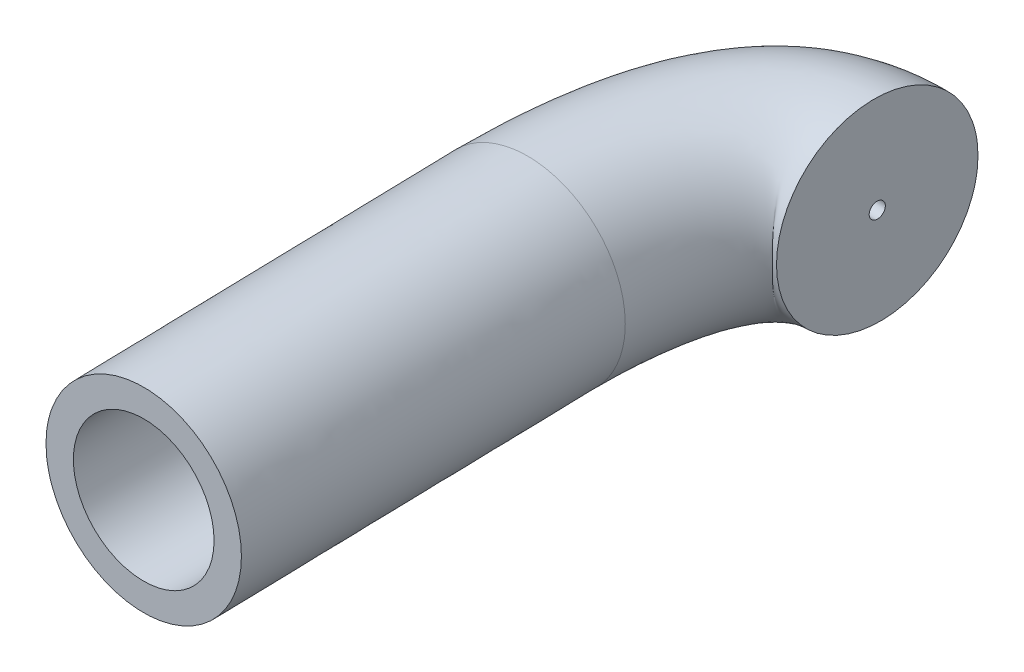
ISO-10303-21;
HEADER;
FILE_DESCRIPTION(('STEP AP214'),'2;1');
FILE_NAME('part.step','',(''),(''),'','','');
FILE_SCHEMA(('AUTOMOTIVE_DESIGN { 1 0 10303 214 1 1 1 1 }'));
ENDSEC;
DATA;
#1=APPLICATION_CONTEXT('core data for automotive mechanical design processes');
#2=APPLICATION_PROTOCOL_DEFINITION('international standard','automotive_design',2000,#1);
#3=PRODUCT_CONTEXT('',#1,'mechanical');
#4=PRODUCT('Part','Part','',(#3));
#5=PRODUCT_RELATED_PRODUCT_CATEGORY('part','',(#4));
#6=PRODUCT_DEFINITION_FORMATION('','',#4);
#7=PRODUCT_DEFINITION_CONTEXT('part definition',#1,'design');
#8=PRODUCT_DEFINITION('design','',#6,#7);
#9=PRODUCT_DEFINITION_SHAPE('','',#8);
#10=(LENGTH_UNIT() NAMED_UNIT(*) SI_UNIT(.MILLI.,.METRE.));
#11=(NAMED_UNIT(*) PLANE_ANGLE_UNIT() SI_UNIT($,.RADIAN.));
#12=(NAMED_UNIT(*) SI_UNIT($,.STERADIAN.) SOLID_ANGLE_UNIT());
#13=UNCERTAINTY_MEASURE_WITH_UNIT(LENGTH_MEASURE(1.E-05),#10,'distance_accuracy_value','');
#14=(GEOMETRIC_REPRESENTATION_CONTEXT(3) GLOBAL_UNCERTAINTY_ASSIGNED_CONTEXT((#13)) GLOBAL_UNIT_ASSIGNED_CONTEXT((#10,
#11,#12)) REPRESENTATION_CONTEXT('',''));
#15=CARTESIAN_POINT('',(0.,0.,0.));
#16=DIRECTION('',(0.,0.,1.));
#17=DIRECTION('',(1.,0.,0.));
#18=AXIS2_PLACEMENT_3D('',#15,#16,#17);
#19=CARTESIAN_POINT('',(0.303189817259408,0.,12.7400996236702));
#20=DIRECTION('',(0.,0.,1.));
#21=DIRECTION('',(1.,0.,0.));
#22=AXIS2_PLACEMENT_3D('',#19,#20,#21);
#23=PLANE('',#22);
#24=CARTESIAN_POINT('',(0.303189817259408,0.,12.7400996236702));
#25=DIRECTION('',(0.,0.,1.));
#26=DIRECTION('',(1.,0.,0.));
#27=AXIS2_PLACEMENT_3D('',#24,#25,#26);
#28=CIRCLE('',#27,2.286);
#29=CARTESIAN_POINT('',(2.58918981725941,0.,12.7400996236702));
#30=VERTEX_POINT('',#29);
#31=EDGE_CURVE('E141',#30,#30,#28,.T.);
#32=ORIENTED_EDGE('',*,*,#31,.F.);
#33=EDGE_LOOP('',(#32));
#34=FACE_BOUND('',#33,.T.);
#35=CARTESIAN_POINT('',(0.303189817259408,0.,12.7400996236702));
#36=DIRECTION('',(0.,0.,1.));
#37=DIRECTION('',(1.,0.,0.));
#38=AXIS2_PLACEMENT_3D('',#35,#36,#37);
#39=CIRCLE('',#38,3.175);
#40=CARTESIAN_POINT('',(3.47818981725941,0.,12.7400996236702));
#41=VERTEX_POINT('',#40);
#42=EDGE_CURVE('E44',#41,#41,#39,.T.);
#43=ORIENTED_EDGE('',*,*,#42,.T.);
#44=EDGE_LOOP('',(#43));
#45=FACE_BOUND('',#44,.T.);
#46=ADVANCED_FACE('F41',(#34,#45),#23,.T.);
#47=CARTESIAN_POINT('',(4.06410833906515,0.,-7.33427679154167));
#48=DIRECTION('',(-0.999500775208623,0.,-0.0315943089394647));
#49=DIRECTION('',(-0.0315943089394647,0.,0.999500775208623));
#50=AXIS2_PLACEMENT_3D('',#47,#48,#49);
#51=PLANE('',#50);
#52=CARTESIAN_POINT('',(4.06410833906515,0.,-7.33427679154167));
#53=DIRECTION('',(0.999500775208623,0.,0.0315943089394649));
#54=DIRECTION('',(0.0315943089394649,0.,-0.999500775208623));
#55=AXIS2_PLACEMENT_3D('',#52,#53,#54);
#56=CIRCLE('',#55,0.254000000000001);
#57=CARTESIAN_POINT('',(4.07213329353578,0.,-7.58814998844466));
#58=VERTEX_POINT('',#57);
#59=EDGE_CURVE('E140',#58,#58,#56,.T.);
#60=ORIENTED_EDGE('',*,*,#59,.F.);
#61=EDGE_LOOP('',(#60));
#62=FACE_BOUND('',#61,.T.);
#63=CARTESIAN_POINT('',(4.06410833906515,0.,-7.33427679154167));
#64=DIRECTION('',(-0.999500775208623,0.,-0.0315943089394647));
#65=DIRECTION('',(-0.0315943089394647,0.,0.999500775208623));
#66=AXIS2_PLACEMENT_3D('',#63,#64,#65);
#67=CIRCLE('',#66,3.175);
#68=CARTESIAN_POINT('',(3.96379640818235,0.,-4.1608618302543));
#69=VERTEX_POINT('',#68);
#70=EDGE_CURVE('E59',#69,#69,#67,.T.);
#71=ORIENTED_EDGE('',*,*,#70,.F.);
#72=EDGE_LOOP('',(#71));
#73=FACE_BOUND('',#72,.T.);
#74=ADVANCED_FACE('F100',(#62,#73),#51,.F.);
#75=CARTESIAN_POINT('',(3.1702417326842,0.,-0.199943389218424));
#76=CARTESIAN_POINT('',(3.47818981725941,0.,12.7400996236702));
#77=CARTESIAN_POINT('',(3.1702417326842,6.35,-0.199943389218423));
#78=CARTESIAN_POINT('',(3.47818981725941,6.35,12.7400996236702));
#79=CARTESIAN_POINT('',(-3.1797582673158,6.35,-0.199943389218423));
#80=CARTESIAN_POINT('',(-2.87181018274059,6.35,12.7400996236702));
#81=CARTESIAN_POINT('',(-3.1797582673158,0.,-0.199943389218424));
#82=CARTESIAN_POINT('',(-2.87181018274059,0.,12.7400996236702));
#83=CARTESIAN_POINT('',(-3.1797582673158,-6.35,-0.199943389218423));
#84=CARTESIAN_POINT('',(-2.87181018274059,-6.35,12.7400996236702));
#85=CARTESIAN_POINT('',(3.1702417326842,-6.35,-0.199943389218423));
#86=CARTESIAN_POINT('',(3.47818981725941,-6.35,12.7400996236702));
#87=CARTESIAN_POINT('',(3.1702417326842,0.,-0.199943389218424));
#88=CARTESIAN_POINT('',(3.47818981725941,0.,12.7400996236702));
#89=(BOUNDED_SURFACE() B_SPLINE_SURFACE(3,1,((#75,#76),(#77,#78),(#79,#80),(#81,#82),(#83,#84),
(#85,#86),(#87,#88)),.UNSPECIFIED.,.T.,.F.,.F.) B_SPLINE_SURFACE_WITH_KNOTS((4,3,4),(2,2),(0.,
0.5,1.),(0.,1.),.UNSPECIFIED.) GEOMETRIC_REPRESENTATION_ITEM() RATIONAL_B_SPLINE_SURFACE(((1.,
1.),(0.333333333333333,0.333333333333333),(0.333333333333333,0.333333333333333),(1.,1.),
(0.333333333333333,0.333333333333333),(0.333333333333333,0.333333333333333),(1.,1.))) REPRESENTATION_ITEM('') SURFACE());
#90=CARTESIAN_POINT('',(0.,-3.175,0.));
#91=CARTESIAN_POINT('',(-0.0243242640618428,-3.17500045158332,0.000288665802833439));
#92=CARTESIAN_POINT('',(-0.0486513394828881,-3.17472058427074,0.000576193073695944));
#93=CARTESIAN_POINT('',(-0.162023609029619,-3.17211134046092,0.00191110235761794));
#94=CARTESIAN_POINT('',(-0.251014858179023,-3.16630984530308,0.00294437193743619));
#95=CARTESIAN_POINT('',(-0.42821263177228,-3.14723858437916,0.00498088866823702));
#96=CARTESIAN_POINT('',(-0.516418835697877,-3.13396589865641,0.00598412391938544));
#97=CARTESIAN_POINT('',(-0.691583746237336,-3.10000777689099,0.00796242018394021));
#98=CARTESIAN_POINT('',(-0.778539646101033,-3.07930775758701,0.00893742166246294));
#99=CARTESIAN_POINT('',(-0.950443872354004,-3.03064206894526,0.0108566255516469));
#100=CARTESIAN_POINT('',(-1.03539056613166,-3.00267069843141,0.0118008031377477));
#101=CARTESIAN_POINT('',(-1.28591482337106,-2.90825029762519,0.0145802700457965));
#102=CARTESIAN_POINT('',(-1.44763363303087,-2.83120584836155,0.0163676000484374));
#103=CARTESIAN_POINT('',(-1.75582617248295,-2.65102291922328,0.0197850179610583));
#104=CARTESIAN_POINT('',(-1.90229920238679,-2.54788324213937,0.0214150986519388));
#105=CARTESIAN_POINT('',(-2.10740340278012,-2.37594171886407,0.0237129504117319));
#106=CARTESIAN_POINT('',(-2.17337881179928,-2.31570706507241,0.0244548295513777));
#107=CARTESIAN_POINT('',(-2.29997655802675,-2.18994189127997,0.0258837254371156));
#108=CARTESIAN_POINT('',(-2.36060400069902,-2.12441653911207,0.0265707944467037));
#109=CARTESIAN_POINT('',(-2.47615330170538,-1.9884584541352,0.0278853744141694));
#110=CARTESIAN_POINT('',(-2.531072369751,-1.9180233492495,0.0285128562326382));
#111=CARTESIAN_POINT('',(-2.63478931443911,-1.77278380873354,0.0297023451376413));
#112=CARTESIAN_POINT('',(-2.68358576783311,-1.69797836308538,0.03026433699838));
#113=CARTESIAN_POINT('',(-2.82022917544752,-1.46779630511198,0.0318435295070483));
#114=CARTESIAN_POINT('',(-2.89843153496795,-1.3065344911588,0.0327551049566311));
#115=CARTESIAN_POINT('',(-3.02661178122052,-0.973259674985233,0.0342558826844416));
#116=CARTESIAN_POINT('',(-3.07659014341516,-0.801246853930925,0.034845090393283));
#117=CARTESIAN_POINT('',(-3.14698932811133,-0.451217089755409,0.0356765567581061));
#118=CARTESIAN_POINT('',(-3.1674044457048,-0.273198994558876,0.03591874844927));
#119=CARTESIAN_POINT('',(-3.17805591152383,0.0837379970835969,0.0360450008852013));
#120=CARTESIAN_POINT('',(-3.16829223222888,0.262656894350844,0.0359290613033832));
#121=CARTESIAN_POINT('',(-3.1188839509595,0.616310971604522,0.0353444207920631));
#122=CARTESIAN_POINT('',(-3.07923694517303,0.791045813859241,0.0348756914841922));
#123=CARTESIAN_POINT('',(-2.97111388367048,1.1314607612037,0.0336051502983484));
#124=CARTESIAN_POINT('',(-2.90263737238336,1.29714072315922,0.0328033331568409));
#125=CARTESIAN_POINT('',(-2.77990418617113,1.5351273560875,0.0313777674541935));
#126=CARTESIAN_POINT('',(-2.73562968539805,1.61273669315896,0.0308651280850067));
#127=CARTESIAN_POINT('',(-2.64070241092992,1.76395324086016,0.0297704578707114));
#128=CARTESIAN_POINT('',(-2.5900511164728,1.83756137400575,0.0291884431204129));
#129=CARTESIAN_POINT('',(-2.48275001495234,1.98021132802885,0.0279607356440589));
#130=CARTESIAN_POINT('',(-2.42610306445553,2.04925529820696,0.0273150732522203));
#131=CARTESIAN_POINT('',(-2.30715713269389,2.18238068792445,0.0259650253020113));
#132=CARTESIAN_POINT('',(-2.24485275098992,2.24645725524428,0.0252605836876141));
#133=CARTESIAN_POINT('',(-2.05028002176849,2.43032926970599,0.0230695700970656));
#134=CARTESIAN_POINT('',(-1.91017037723957,2.54200810462485,0.021503225089679));
#135=CARTESIAN_POINT('',(-1.61317513190899,2.7402146497617,0.0182009858618158));
#136=CARTESIAN_POINT('',(-1.45629014673595,2.82674328251952,0.0164650978635025));
#137=CARTESIAN_POINT('',(-1.21177817413075,2.93588962238645,0.0137572163783273));
#138=CARTESIAN_POINT('',(-1.12863410412454,2.96885878169343,0.0128360348966054));
#139=CARTESIAN_POINT('',(-0.959909870388115,3.02765004611898,0.0109616365599269));
#140=CARTESIAN_POINT('',(-0.874331764016679,3.05347800028465,0.0100084466436609));
#141=CARTESIAN_POINT('',(-0.701465604202956,3.09778254841303,0.00807298944110577));
#142=CARTESIAN_POINT('',(-0.614180911847224,3.11627231239113,0.00709077767759988));
#143=CARTESIAN_POINT('',(-0.43838167441245,3.14583606808765,0.00509637268219461));
#144=CARTESIAN_POINT('',(-0.349867460590093,3.15691201913796,0.00408418744562388));
#145=CARTESIAN_POINT('',(-0.198472285382937,3.16940981183432,0.00233301987873588));
#146=CARTESIAN_POINT('',(-0.13574165777698,3.17271680708173,0.00160164012473092));
#147=CARTESIAN_POINT('',(-0.0486527687669616,3.1747203220212,0.000576211321581473));
#148=CARTESIAN_POINT('',(-0.0243259216950558,3.17500012825551,0.000288687265111917));
#149=CARTESIAN_POINT('',(7.70034666939436E-13,3.175,0.));
#150=B_SPLINE_CURVE_WITH_KNOTS('',3,(#90,#91,#92,#93,#94,#95,#96,#97,#98,#99,#100,#101,#102,
#103,#104,#105,#106,#107,#108,#109,#110,#111,#112,#113,#114,#115,#116,#117,#118,#119,#120,#121,
#122,#123,#124,#125,#126,#127,#128,#129,#130,#131,#132,#133,#134,#135,#136,#137,#138,#139,#140,
#141,#142,#143,#144,#145,#146,#147,#148,#149),.UNSPECIFIED.,.F.,.F.,(4,2,2,2,2,2,2,2,2,2,2,2,2,
2,2,2,2,2,2,2,2,2,2,2,2,2,2,2,2,4),(0.,0.0729839886956248,0.34019049833482,0.6075015125625,
0.875340279050419,1.14338968395423,1.67810918771946,2.21285322805054,2.48060502636088,
2.74809838333661,3.01572188382412,3.28340748063182,3.81831454385743,4.35321259574993,
4.88821385477649,5.42321560167932,5.95826038866723,6.49331363088388,6.76110703086208,
7.02883842432286,7.29644282935424,7.56430542341512,8.09913647247509,8.63394790080851,
8.90202238304398,9.16987664240502,9.43724797992242,9.70454862827504,9.89290326976935,
9.96588725846487),.UNSPECIFIED.);
#151=CARTESIAN_POINT('',(0.,-3.175,0.));
#152=VERTEX_POINT('',#151);
#153=CARTESIAN_POINT('',(7.70034666939436E-13,3.175,0.));
#154=VERTEX_POINT('',#153);
#155=EDGE_CURVE('E11',#152,#154,#150,.T.);
#156=CARTESIAN_POINT('',(0.,-3.175,0.));
#157=CARTESIAN_POINT('',(0.024320915640332,-3.17500152828855,-0.000288633915562159));
#158=CARTESIAN_POINT('',(0.0486480463256703,-3.17472157399919,-0.000576746838505363));
#159=CARTESIAN_POINT('',(0.25097281087921,-3.17005749423789,-0.00296825873212495));
#160=CARTESIAN_POINT('',(0.42891100688444,-3.15091862572811,-0.00504141358079995));
#161=CARTESIAN_POINT('',(0.779358740104613,-3.08300245437952,-0.00908846138254562));
#162=CARTESIAN_POINT('',(0.951853188493095,-3.03414928459037,-0.0110620861996462));
#163=CARTESIAN_POINT('',(1.28605808787721,-2.90819793925865,-0.0148710371205686));
#164=CARTESIAN_POINT('',(1.44777861109108,-2.83112659475338,-0.0167064926094675));
#165=CARTESIAN_POINT('',(1.75587217144482,-2.65098000443237,-0.0202037572398174));
#166=CARTESIAN_POINT('',(1.90225504352628,-2.54792156852946,-0.021865677654559));
#167=CARTESIAN_POINT('',(2.17569167610588,-2.31867446178536,-0.0249794731912945));
#168=CARTESIAN_POINT('',(2.30274048030863,-2.19247987820213,-0.02643129444963));
#169=CARTESIAN_POINT('',(2.53390551533197,-1.92049637190289,-0.0290848506387535));
#170=CARTESIAN_POINT('',(2.63801255437165,-1.7746996329763,-0.0302864853199122));
#171=CARTESIAN_POINT('',(2.82033286998893,-1.4676262529875,-0.0324006948447574));
#172=CARTESIAN_POINT('',(2.89852956023727,-1.30633978114768,-0.0333130845141686));
#173=CARTESIAN_POINT('',(3.02664748217791,-0.973037737423168,-0.0348132743676568));
#174=CARTESIAN_POINT('',(3.07660504649937,-0.801036269478055,-0.0354014916094062));
#175=CARTESIAN_POINT('',(3.12914452097452,-0.539911963645299,-0.0360211780123513));
#176=CARTESIAN_POINT('',(3.14290752843983,-0.452892504044122,-0.0361837563221198));
#177=CARTESIAN_POINT('',(3.16315198391119,-0.278078078276697,-0.0364230227315626));
#178=CARTESIAN_POINT('',(3.1696421137102,-0.190284163104493,-0.0364998132376753));
#179=CARTESIAN_POINT('',(3.17389211883059,-0.0586156959626618,-0.0365501004156488));
#180=CARTESIAN_POINT('',(3.17439849461955,-0.0148070968477235,-0.0365560925868962));
#181=CARTESIAN_POINT('',(3.17319328812466,0.116924236761468,-0.0365418277047982));
#182=CARTESIAN_POINT('',(3.16873462177027,0.204844334777334,-0.0364890600201672));
#183=CARTESIAN_POINT('',(3.15253582897358,0.380081102854745,-0.0362975352389034));
#184=CARTESIAN_POINT('',(3.14078699708831,0.46739692509661,-0.0361586753366895));
#185=CARTESIAN_POINT('',(3.09429633482802,0.72969211793444,-0.0356099429748473));
#186=CARTESIAN_POINT('',(3.04832999542919,0.902815771243072,-0.0350681685524297));
#187=CARTESIAN_POINT('',(2.92788731056893,1.23909360936051,-0.0336562160404998));
#188=CARTESIAN_POINT('',(2.85337402720586,1.40223455868552,-0.0327856124880276));
#189=CARTESIAN_POINT('',(2.72197795511288,1.63566993258133,-0.0312597330240234));
#190=CARTESIAN_POINT('',(2.67489160662818,1.71162293113587,-0.0307142525698514));
#191=CARTESIAN_POINT('',(2.57448795850315,1.85929487942294,-0.0295543255563499));
#192=CARTESIAN_POINT('',(2.52117193006133,1.93101468847963,-0.0289398930680495));
#193=CARTESIAN_POINT('',(2.40872937792708,2.06964693038614,-0.0276474466167591));
#194=CARTESIAN_POINT('',(2.34960763670993,2.13656324276173,-0.0269694850068157));
#195=CARTESIAN_POINT('',(2.22590055644312,2.26523012273819,-0.025554093409936));
#196=CARTESIAN_POINT('',(2.161310123436,2.32697576511429,-0.0248166080085316));
#197=CARTESIAN_POINT('',(1.96017410509032,2.50359971050359,-0.0225242327690824));
#198=CARTESIAN_POINT('',(1.816088302654,2.6100809724189,-0.0208874072501923));
#199=CARTESIAN_POINT('',(1.51206463491849,2.79730531554978,-0.0174361241661743));
#200=CARTESIAN_POINT('',(1.35212594603233,2.8780470586297,-0.0156216573723113));
#201=CARTESIAN_POINT('',(1.09815830994927,2.980462011515,-0.0127301559212831));
#202=CARTESIAN_POINT('',(1.00804648192278,3.01214710660084,-0.0117023466155567));
#203=CARTESIAN_POINT('',(0.825382104479104,3.06725906534303,-0.00961204070040891));
#204=CARTESIAN_POINT('',(0.732831474777233,3.0906922274551,-0.0085495712258524));
#205=CARTESIAN_POINT('',(0.546206727797448,3.12908680847916,-0.00639703294123657));
#206=CARTESIAN_POINT('',(0.452136279982301,3.14406618571273,-0.00530702781415063));
#207=CARTESIAN_POINT('',(0.263056009708581,3.16550699257681,-0.00310253837744755));
#208=CARTESIAN_POINT('',(0.168046665448186,3.17197255379704,-0.00198806620836871));
#209=CARTESIAN_POINT('',(0.0486511114422273,3.17472063108094,-0.000576781001709529));
#210=CARTESIAN_POINT('',(0.0243240356377926,3.17500050426666,-0.0002886685074238));
#211=CARTESIAN_POINT('',(7.70034666939436E-13,3.175,0.));
#212=B_SPLINE_CURVE_WITH_KNOTS('',3,(#156,#157,#158,#159,#160,#161,#162,#163,#164,#165,#166,
#167,#168,#169,#170,#171,#172,#173,#174,#175,#176,#177,#178,#179,#180,#181,#182,#183,#184,#185,
#186,#187,#188,#189,#190,#191,#192,#193,#194,#195,#196,#197,#198,#199,#200,#201,#202,#203,#204,
#205,#206,#207,#208,#209,#210,#211),.UNSPECIFIED.,.F.,.F.,(4,2,2,2,2,2,2,2,2,2,2,2,2,2,2,2,2,2,
2,2,2,2,2,2,2,2,2,4),(0.,0.0729839886405925,0.607024116611575,1.14243352031585,1.67733515057934,
2.21189166001143,2.74658497319501,3.28149212711432,3.81674103955743,4.35129972085177,
4.61536351864882,4.87911176081514,5.0105236877403,5.27427190700572,5.53833568501958,
6.07299157815614,6.60834163087347,6.87617326066996,7.1439503331649,7.41150864483183,
7.67931898197151,8.21411548230454,8.74893978088863,9.035184425027,9.32121011113405,
9.60662588529243,9.89190310160621,9.96488709024686),.UNSPECIFIED.);
#213=EDGE_CURVE('E49',#152,#154,#212,.T.);
#214=ORIENTED_EDGE('',*,*,#155,.F.);
#215=ORIENTED_EDGE('',*,*,#213,.T.);
#216=EDGE_LOOP('',(#214,#215));
#217=FACE_BOUND('',#216,.T.);
#218=ORIENTED_EDGE('',*,*,#42,.F.);
#219=EDGE_LOOP('',(#218));
#220=FACE_BOUND('',#219,.T.);
#221=ADVANCED_FACE('F67',(#217,#220),#89,.T.);
#222=CARTESIAN_POINT('',(3.96379640818235,0.,-4.1608618302543));
#223=CARTESIAN_POINT('',(3.76578711824669,0.,-4.15099818075937));
#224=CARTESIAN_POINT('',(3.8074082894387,0.,-4.11674379435117));
#225=CARTESIAN_POINT('',(3.88668366913277,0.,-4.12918017495681));
#226=CARTESIAN_POINT('',(3.8668422298229,0.,-4.13442018558328));
#227=CARTESIAN_POINT('',(3.64491574807778,0.,-3.68968557948007));
#228=CARTESIAN_POINT('',(3.47987946940334,0.,-3.24439776325947));
#229=CARTESIAN_POINT('',(3.3030556803385,0.,-2.23484604911328));
#230=CARTESIAN_POINT('',(3.25452079378139,0.,-1.84337667069413));
#231=CARTESIAN_POINT('',(3.20555959080282,0.,-1.17975297557298));
#232=CARTESIAN_POINT('',(3.19315405405152,0.,-0.945806098032062));
#233=CARTESIAN_POINT('',(3.17699520906058,0.,-0.453327647976818));
#234=CARTESIAN_POINT('',(3.17367641141264,0.,-0.213031271610009));
#235=CARTESIAN_POINT('',(3.17420202457295,0.,0.146079935132406));
#236=CARTESIAN_POINT('',(3.17409420057007,0.,0.225428207302404));
#237=CARTESIAN_POINT('',(3.17409184008441,0.,0.300323544880002));
#238=CARTESIAN_POINT('',(3.96379640818235,6.35,-4.1608618302543));
#239=CARTESIAN_POINT('',(3.76578711824669,6.35,-4.15099818075937));
#240=CARTESIAN_POINT('',(3.8074082894387,6.35,-4.11674379435117));
#241=CARTESIAN_POINT('',(3.88668366913277,6.35,-4.12918017495681));
#242=CARTESIAN_POINT('',(3.8668422298229,6.35,-4.13442018558328));
#243=CARTESIAN_POINT('',(3.64491574807778,6.35,-3.68968557948007));
#244=CARTESIAN_POINT('',(3.47987946940334,6.35,-3.24439776325947));
#245=CARTESIAN_POINT('',(3.3030556803385,6.35,-2.23484604911328));
#246=CARTESIAN_POINT('',(3.25452079378139,6.35,-1.84337667069412));
#247=CARTESIAN_POINT('',(3.20555959080282,6.35,-1.17975297557297));
#248=CARTESIAN_POINT('',(3.19315405405152,6.35,-0.94580609803206));
#249=CARTESIAN_POINT('',(3.17699520906058,6.35,-0.453327647976816));
#250=CARTESIAN_POINT('',(3.17367641141264,6.35,-0.213031271610007));
#251=CARTESIAN_POINT('',(3.17420202457295,6.35,0.146079935132408));
#252=CARTESIAN_POINT('',(3.17409420057007,6.35,0.225428207302405));
#253=CARTESIAN_POINT('',(3.17409184008441,6.35,0.300323544880004));
#254=CARTESIAN_POINT('',(4.16442026994795,6.35,-10.507691752829));
#255=CARTESIAN_POINT('',(3.00780416524099,6.35,-10.5281298039284));
#256=CARTESIAN_POINT('',(1.78087610060768,6.35,-10.2647201252168));
#257=CARTESIAN_POINT('',(-0.330376063573164,6.35,-9.04047868095629));
#258=CARTESIAN_POINT('',(-1.15720451530673,6.35,-8.12109767178777));
#259=CARTESIAN_POINT('',(-2.2899808132496,6.35,-6.12107334737366));
#260=CARTESIAN_POINT('',(-2.63297742322048,6.35,-5.03574323162461));
#261=CARTESIAN_POINT('',(-2.96422521532315,6.35,-3.28701034774298));
#262=CARTESIAN_POINT('',(-3.04271789718911,6.35,-2.68199191014169));
#263=CARTESIAN_POINT('',(-3.12080360889492,6.35,-1.73529445621177));
#264=CARTESIAN_POINT('',(-3.14016463738,6.35,-1.41320271323352));
#265=CARTESIAN_POINT('',(-3.16637411021251,6.35,-0.755074113910521));
#266=CARTESIAN_POINT('',(-3.17365131852802,6.35,-0.400791599890125));
#267=CARTESIAN_POINT('',(-3.17420814786395,6.35,0.00370818714853626));
#268=CARTESIAN_POINT('',(-3.17410364251287,6.35,0.074153143008343));
#269=CARTESIAN_POINT('',(-3.17410600299852,6.35,0.149048480585941));
#270=CARTESIAN_POINT('',(4.16442026994795,0.,-10.5076917528291));
#271=CARTESIAN_POINT('',(3.00780416524099,0.,-10.5281298039273));
#272=CARTESIAN_POINT('',(1.78087610060742,0.,-10.2647201252168));
#273=CARTESIAN_POINT('',(-0.330376063572906,0.,-9.04047868095629));
#274=CARTESIAN_POINT('',(-1.15720451530673,0.,-8.12109767178777));
#275=CARTESIAN_POINT('',(-2.2899808132496,0.,-6.12107334737366));
#276=CARTESIAN_POINT('',(-2.63297742322049,0.,-5.0357432316242));
#277=CARTESIAN_POINT('',(-2.96422521532315,0.,-3.28701034774319));
#278=CARTESIAN_POINT('',(-3.04271789718911,0.,-2.68199191014169));
#279=CARTESIAN_POINT('',(-3.12080360889492,0.,-1.73529445621177));
#280=CARTESIAN_POINT('',(-3.14016463738,0.,-1.41320271323352));
#281=CARTESIAN_POINT('',(-3.16637411021251,0.,-0.755074113910523));
#282=CARTESIAN_POINT('',(-3.17365131852802,0.,-0.400791599890127));
#283=CARTESIAN_POINT('',(-3.17420814786395,0.,0.00370818714853453));
#284=CARTESIAN_POINT('',(-3.17410364251287,0.,0.0741531430083413));
#285=CARTESIAN_POINT('',(-3.17410600299852,0.,0.14904848058594));
#286=CARTESIAN_POINT('',(4.16442026994795,-6.35,-10.5076917528291));
#287=CARTESIAN_POINT('',(3.00780416524099,-6.35,-10.5281298039261));
#288=CARTESIAN_POINT('',(1.78087610060717,-6.35,-10.2647201252168));
#289=CARTESIAN_POINT('',(-0.330376063572651,-6.35,-9.04047868095629));
#290=CARTESIAN_POINT('',(-1.15720451530673,-6.35,-8.12109767178777));
#291=CARTESIAN_POINT('',(-2.2899808132496,-6.35,-6.12107334737366));
#292=CARTESIAN_POINT('',(-2.63297742322049,-6.35,-5.0357432316238));
#293=CARTESIAN_POINT('',(-2.96422521532315,-6.35,-3.28701034774339));
#294=CARTESIAN_POINT('',(-3.04271789718911,-6.35,-2.68199191014169));
#295=CARTESIAN_POINT('',(-3.12080360889492,-6.35,-1.73529445621177));
#296=CARTESIAN_POINT('',(-3.14016463738,-6.35,-1.41320271323352));
#297=CARTESIAN_POINT('',(-3.16637411021251,-6.35,-0.755074113910521));
#298=CARTESIAN_POINT('',(-3.17365131852802,-6.35,-0.400791599890125));
#299=CARTESIAN_POINT('',(-3.17420814786395,-6.35,0.00370818714853626));
#300=CARTESIAN_POINT('',(-3.17410364251287,-6.35,0.074153143008343));
#301=CARTESIAN_POINT('',(-3.17410600299853,-6.35,0.149048480585941));
#302=CARTESIAN_POINT('',(3.96379640818235,-6.35,-4.1608618302543));
#303=CARTESIAN_POINT('',(3.76578711824669,-6.35,-4.15099818075937));
#304=CARTESIAN_POINT('',(3.8074082894387,-6.35,-4.11674379435117));
#305=CARTESIAN_POINT('',(3.88668366913277,-6.35,-4.12918017495681));
#306=CARTESIAN_POINT('',(3.8668422298229,-6.35,-4.13442018558328));
#307=CARTESIAN_POINT('',(3.64491574807778,-6.35,-3.68968557948007));
#308=CARTESIAN_POINT('',(3.47987946940334,-6.35,-3.24439776325947));
#309=CARTESIAN_POINT('',(3.3030556803385,-6.35,-2.23484604911328));
#310=CARTESIAN_POINT('',(3.25452079378139,-6.35,-1.84337667069412));
#311=CARTESIAN_POINT('',(3.20555959080282,-6.35,-1.17975297557297));
#312=CARTESIAN_POINT('',(3.19315405405152,-6.35,-0.94580609803206));
#313=CARTESIAN_POINT('',(3.17699520906058,-6.35,-0.453327647976816));
#314=CARTESIAN_POINT('',(3.17367641141264,-6.35,-0.213031271610007));
#315=CARTESIAN_POINT('',(3.17420202457295,-6.35,0.146079935132408));
#316=CARTESIAN_POINT('',(3.17409420057007,-6.35,0.225428207302405));
#317=CARTESIAN_POINT('',(3.17409184008441,-6.35,0.300323544880004));
#318=CARTESIAN_POINT('',(3.96379640818235,0.,-4.1608618302543));
#319=CARTESIAN_POINT('',(3.76578711824669,0.,-4.15099818075937));
#320=CARTESIAN_POINT('',(3.8074082894387,0.,-4.11674379435117));
#321=CARTESIAN_POINT('',(3.88668366913277,0.,-4.12918017495681));
#322=CARTESIAN_POINT('',(3.8668422298229,0.,-4.13442018558328));
#323=CARTESIAN_POINT('',(3.64491574807778,0.,-3.68968557948007));
#324=CARTESIAN_POINT('',(3.47987946940334,0.,-3.24439776325947));
#325=CARTESIAN_POINT('',(3.3030556803385,0.,-2.23484604911328));
#326=CARTESIAN_POINT('',(3.25452079378139,0.,-1.84337667069413));
#327=CARTESIAN_POINT('',(3.20555959080282,0.,-1.17975297557298));
#328=CARTESIAN_POINT('',(3.19315405405152,0.,-0.945806098032062));
#329=CARTESIAN_POINT('',(3.17699520906058,0.,-0.453327647976818));
#330=CARTESIAN_POINT('',(3.17367641141264,0.,-0.213031271610009));
#331=CARTESIAN_POINT('',(3.17420202457295,0.,0.146079935132406));
#332=CARTESIAN_POINT('',(3.17409420057007,0.,0.225428207302404));
#333=CARTESIAN_POINT('',(3.17409184008441,0.,0.300323544880002));
#334=(BOUNDED_SURFACE() B_SPLINE_SURFACE(3,3,((#222,#223,#224,#225,#226,#227,#228,#229,#230,
#231,#232,#233,#234,#235,#236,#237),(#238,#239,#240,#241,#242,#243,#244,#245,#246,#247,#248,
#249,#250,#251,#252,#253),(#254,#255,#256,#257,#258,#259,#260,#261,#262,#263,#264,#265,#266,
#267,#268,#269),(#270,#271,#272,#273,#274,#275,#276,#277,#278,#279,#280,#281,#282,#283,#284,
#285),(#286,#287,#288,#289,#290,#291,#292,#293,#294,#295,#296,#297,#298,#299,#300,#301),(#302,
#303,#304,#305,#306,#307,#308,#309,#310,#311,#312,#313,#314,#315,#316,#317),(#318,#319,#320,
#321,#322,#323,#324,#325,#326,#327,#328,#329,#330,#331,#332,#333)),.UNSPECIFIED.,.T.,.F.,
.F.) B_SPLINE_SURFACE_WITH_KNOTS((4,3,4),(4,2,2,2,2,2,2,4),(0.,0.5,1.),(0.,0.25,0.5,0.75,0.875,
0.9375,1.,1.01525156209914),
.UNSPECIFIED.) GEOMETRIC_REPRESENTATION_ITEM() RATIONAL_B_SPLINE_SURFACE(((1.,1.,1.,1.,1.,1.,1.,
1.,1.,1.,1.,1.,1.,1.,1.,1.),(0.333333333333333,0.333333333333333,0.333333333333333,
0.333333333333333,0.333333333333333,0.333333333333333,0.333333333333333,0.333333333333333,
0.333333333333333,0.333333333333333,0.333333333333333,0.333333333333333,0.333333333333333,
0.333333333333333,0.333333333333333,0.333333333333333),(0.333333333333333,0.333333333333333,
0.333333333333333,0.333333333333333,0.333333333333333,0.333333333333333,0.333333333333333,
0.333333333333333,0.333333333333333,0.333333333333333,0.333333333333333,0.333333333333333,
0.333333333333333,0.333333333333333,0.333333333333333,0.333333333333333),(1.,1.,1.,1.,1.,1.,1.,
1.,1.,1.,1.,1.,1.,1.,1.,1.),(0.333333333333333,0.333333333333333,0.333333333333333,
0.333333333333333,0.333333333333333,0.333333333333333,0.333333333333333,0.333333333333333,
0.333333333333333,0.333333333333333,0.333333333333333,0.333333333333333,0.333333333333333,
0.333333333333333,0.333333333333333,0.333333333333333),(0.333333333333333,0.333333333333333,
0.333333333333333,0.333333333333333,0.333333333333333,0.333333333333333,0.333333333333333,
0.333333333333333,0.333333333333333,0.333333333333333,0.333333333333333,0.333333333333333,
0.333333333333333,0.333333333333333,0.333333333333333,0.333333333333333),(1.,1.,1.,1.,1.,1.,1.,
1.,1.,1.,1.,1.,1.,1.,1.,1.))) REPRESENTATION_ITEM('') SURFACE());
#335=ORIENTED_EDGE('',*,*,#213,.F.);
#336=ORIENTED_EDGE('',*,*,#155,.T.);
#337=EDGE_LOOP('',(#335,#336));
#338=FACE_BOUND('',#337,.T.);
#339=ORIENTED_EDGE('',*,*,#70,.T.);
#340=EDGE_LOOP('',(#339));
#341=FACE_BOUND('',#340,.T.);
#342=ADVANCED_FACE('F70',(#338,#341),#334,.T.);
#343=CARTESIAN_POINT('',(1.52537637003525,0.,-7.41452633624791));
#344=DIRECTION('',(0.999500775208623,0.,0.0315943089394649));
#345=DIRECTION('',(0.0315943089394649,0.,-0.999500775208623));
#346=AXIS2_PLACEMENT_3D('',#343,#344,#345);
#347=CYLINDRICAL_SURFACE('',#346,0.254000000000001);
#348=CARTESIAN_POINT('',(1.52537637003525,0.,-7.41452633624791));
#349=DIRECTION('',(0.999500775208623,0.,0.0315943089394649));
#350=DIRECTION('',(0.0315943089394649,0.,-0.999500775208623));
#351=AXIS2_PLACEMENT_3D('',#348,#349,#350);
#352=CIRCLE('',#351,0.254000000000001);
#353=CARTESIAN_POINT('',(1.53340132450587,0.,-7.6683995331509));
#354=VERTEX_POINT('',#353);
#355=EDGE_CURVE('E144',#354,#354,#352,.T.);
#356=ORIENTED_EDGE('',*,*,#355,.F.);
#357=EDGE_LOOP('',(#356));
#358=FACE_BOUND('',#357,.T.);
#359=ORIENTED_EDGE('',*,*,#59,.T.);
#360=EDGE_LOOP('',(#359));
#361=FACE_BOUND('',#360,.T.);
#362=ADVANCED_FACE('F112',(#358,#361),#347,.F.);
#363=CARTESIAN_POINT('',(1.52537637003525,0.,-7.41452633624791));
#364=DIRECTION('',(0.999500775208623,0.,0.0315943089394649));
#365=DIRECTION('',(0.0315943089394649,0.,-0.999500775208623));
#366=AXIS2_PLACEMENT_3D('',#363,#364,#365);
#367=PLANE('',#366);
#368=ORIENTED_EDGE('',*,*,#355,.T.);
#369=EDGE_LOOP('',(#368));
#370=FACE_BOUND('',#369,.T.);
#371=ADVANCED_FACE('F118',(#370),#367,.T.);
#372=CARTESIAN_POINT('',(0.303189817259408,0.,2.32609962367017));
#373=DIRECTION('',(0.,0.,1.));
#374=DIRECTION('',(1.,0.,0.));
#375=AXIS2_PLACEMENT_3D('',#372,#373,#374);
#376=CYLINDRICAL_SURFACE('',#375,2.286);
#377=CARTESIAN_POINT('',(0.303189817259408,0.,2.32609962367017));
#378=DIRECTION('',(0.,0.,1.));
#379=DIRECTION('',(1.,0.,0.));
#380=AXIS2_PLACEMENT_3D('',#377,#378,#379);
#381=CIRCLE('',#380,2.286);
#382=CARTESIAN_POINT('',(2.58918981725941,0.,2.32609962367017));
#383=VERTEX_POINT('',#382);
#384=EDGE_CURVE('E139',#383,#383,#381,.T.);
#385=ORIENTED_EDGE('',*,*,#384,.F.);
#386=EDGE_LOOP('',(#385));
#387=FACE_BOUND('',#386,.T.);
#388=ORIENTED_EDGE('',*,*,#31,.T.);
#389=EDGE_LOOP('',(#388));
#390=FACE_BOUND('',#389,.T.);
#391=ADVANCED_FACE('F123',(#387,#390),#376,.F.);
#392=CARTESIAN_POINT('',(0.303189817259408,0.,2.32609962367017));
#393=DIRECTION('',(0.,0.,1.));
#394=DIRECTION('',(1.,0.,0.));
#395=AXIS2_PLACEMENT_3D('',#392,#393,#394);
#396=PLANE('',#395);
#397=ORIENTED_EDGE('',*,*,#384,.T.);
#398=EDGE_LOOP('',(#397));
#399=FACE_BOUND('',#398,.T.);
#400=ADVANCED_FACE('F131',(#399),#396,.T.);
#401=CLOSED_SHELL('',(#46,#74,#221,#342,#362,#371,#391,#400));
#402=MANIFOLD_SOLID_BREP('B2',#401);
#403=ADVANCED_BREP_SHAPE_REPRESENTATION('',(#18,#402),#14);
#404=SHAPE_DEFINITION_REPRESENTATION(#9,#403);
ENDSEC;
END-ISO-10303-21;
